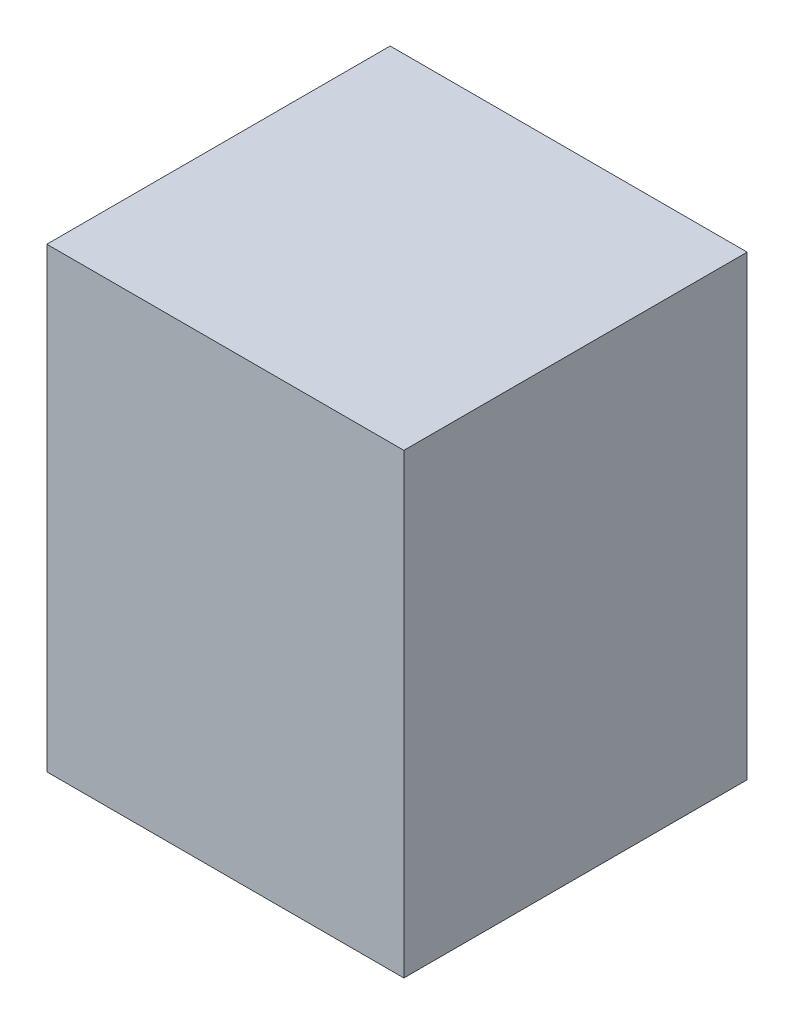
ISO-10303-21;
HEADER;
FILE_DESCRIPTION(('STEP AP214'),'2;1');
FILE_NAME('part.step','',(''),(''),'','','');
FILE_SCHEMA(('AUTOMOTIVE_DESIGN { 1 0 10303 214 1 1 1 1 }'));
ENDSEC;
DATA;
#1=APPLICATION_CONTEXT('core data for automotive mechanical design processes');
#2=APPLICATION_PROTOCOL_DEFINITION('international standard','automotive_design',2000,#1);
#3=PRODUCT_CONTEXT('',#1,'mechanical');
#4=PRODUCT('Part','Part','',(#3));
#5=PRODUCT_RELATED_PRODUCT_CATEGORY('part','',(#4));
#6=PRODUCT_DEFINITION_FORMATION('','',#4);
#7=PRODUCT_DEFINITION_CONTEXT('part definition',#1,'design');
#8=PRODUCT_DEFINITION('design','',#6,#7);
#9=PRODUCT_DEFINITION_SHAPE('','',#8);
#10=(LENGTH_UNIT() NAMED_UNIT(*) SI_UNIT(.MILLI.,.METRE.));
#11=(NAMED_UNIT(*) PLANE_ANGLE_UNIT() SI_UNIT($,.RADIAN.));
#12=(NAMED_UNIT(*) SI_UNIT($,.STERADIAN.) SOLID_ANGLE_UNIT());
#13=UNCERTAINTY_MEASURE_WITH_UNIT(LENGTH_MEASURE(1.E-05),#10,'distance_accuracy_value','');
#14=(GEOMETRIC_REPRESENTATION_CONTEXT(3) GLOBAL_UNCERTAINTY_ASSIGNED_CONTEXT((#13)) GLOBAL_UNIT_ASSIGNED_CONTEXT((#10,
#11,#12)) REPRESENTATION_CONTEXT('',''));
#15=CARTESIAN_POINT('',(0.,0.,0.));
#16=DIRECTION('',(0.,0.,1.));
#17=DIRECTION('',(1.,0.,0.));
#18=AXIS2_PLACEMENT_3D('',#15,#16,#17);
#19=CARTESIAN_POINT('',(-84.0290206079077,-281.7434461342,-434.633256851999));
#20=DIRECTION('',(1.,0.,0.));
#21=DIRECTION('',(0.,1.,0.));
#22=AXIS2_PLACEMENT_3D('',#19,#20,#21);
#23=PLANE('',#22);
#24=DIRECTION('',(0.,1.,0.));
#25=VECTOR('',#24,1.);
#26=CARTESIAN_POINT('',(-84.0290206079077,-281.7434461342,-434.633256851999));
#27=LINE('',#26,#25);
#28=CARTESIAN_POINT('',(-84.0290206079077,-281.7434461342,-434.633256851999));
#29=VERTEX_POINT('',#28);
#30=CARTESIAN_POINT('',(-84.0290206079077,-235.155967892815,-434.633256851999));
#31=VERTEX_POINT('',#30);
#32=EDGE_CURVE('E137',#29,#31,#27,.T.);
#33=ORIENTED_EDGE('',*,*,#32,.T.);
#34=DIRECTION('',(0.,0.,1.));
#35=VECTOR('',#34,1.);
#36=CARTESIAN_POINT('',(-84.0290206079077,-235.155967892815,-434.633256851999));
#37=LINE('',#36,#35);
#38=CARTESIAN_POINT('',(-84.0290206079077,-235.155967892815,-399.633256851999));
#39=VERTEX_POINT('',#38);
#40=EDGE_CURVE('E124',#31,#39,#37,.T.);
#41=ORIENTED_EDGE('',*,*,#40,.T.);
#42=DIRECTION('',(0.,1.,0.));
#43=VECTOR('',#42,1.);
#44=CARTESIAN_POINT('',(-84.0290206079077,-281.7434461342,-399.633256851999));
#45=LINE('',#44,#43);
#46=CARTESIAN_POINT('',(-84.0290206079077,-281.7434461342,-399.633256851999));
#47=VERTEX_POINT('',#46);
#48=EDGE_CURVE('E143',#47,#39,#45,.T.);
#49=ORIENTED_EDGE('',*,*,#48,.F.);
#50=DIRECTION('',(0.,0.,1.));
#51=VECTOR('',#50,1.);
#52=CARTESIAN_POINT('',(-84.0290206079077,-281.7434461342,-434.633256851999));
#53=LINE('',#52,#51);
#54=EDGE_CURVE('E123',#29,#47,#53,.T.);
#55=ORIENTED_EDGE('',*,*,#54,.F.);
#56=EDGE_LOOP('',(#33,#41,#49,#55));
#57=FACE_BOUND('',#56,.T.);
#58=ADVANCED_FACE('F37',(#57),#23,.T.);
#59=CARTESIAN_POINT('',(-84.0290206079077,-235.155967892815,-434.633256851999));
#60=DIRECTION('',(0.,1.,0.));
#61=DIRECTION('',(0.,0.,1.));
#62=AXIS2_PLACEMENT_3D('',#59,#60,#61);
#63=PLANE('',#62);
#64=DIRECTION('',(-1.,0.,0.));
#65=VECTOR('',#64,1.);
#66=CARTESIAN_POINT('',(-84.0290206079077,-235.155967892815,-399.633256851999));
#67=LINE('',#66,#65);
#68=CARTESIAN_POINT('',(-120.427773553477,-235.155967892815,-399.633256851999));
#69=VERTEX_POINT('',#68);
#70=EDGE_CURVE('E140',#39,#69,#67,.T.);
#71=ORIENTED_EDGE('',*,*,#70,.F.);
#72=ORIENTED_EDGE('',*,*,#40,.F.);
#73=DIRECTION('',(-1.,0.,0.));
#74=VECTOR('',#73,1.);
#75=CARTESIAN_POINT('',(-84.0290206079077,-235.155967892815,-434.633256851999));
#76=LINE('',#75,#74);
#77=CARTESIAN_POINT('',(-120.427773553477,-235.155967892815,-434.633256851999));
#78=VERTEX_POINT('',#77);
#79=EDGE_CURVE('E150',#31,#78,#76,.T.);
#80=ORIENTED_EDGE('',*,*,#79,.T.);
#81=DIRECTION('',(0.,0.,1.));
#82=VECTOR('',#81,1.);
#83=CARTESIAN_POINT('',(-120.427773553477,-235.155967892815,-434.633256851999));
#84=LINE('',#83,#82);
#85=EDGE_CURVE('E127',#78,#69,#84,.T.);
#86=ORIENTED_EDGE('',*,*,#85,.T.);
#87=EDGE_LOOP('',(#71,#72,#80,#86));
#88=FACE_BOUND('',#87,.T.);
#89=ADVANCED_FACE('F195',(#88),#63,.T.);
#90=CARTESIAN_POINT('',(-84.0290206079077,-281.7434461342,-434.633256851999));
#91=DIRECTION('',(0.,-1.,0.));
#92=DIRECTION('',(0.,0.,-1.));
#93=AXIS2_PLACEMENT_3D('',#90,#91,#92);
#94=PLANE('',#93);
#95=DIRECTION('',(1.,0.,0.));
#96=VECTOR('',#95,1.);
#97=CARTESIAN_POINT('',(-84.0290206079077,-281.7434461342,-399.633256851999));
#98=LINE('',#97,#96);
#99=CARTESIAN_POINT('',(-120.427773553477,-281.7434461342,-399.633256851999));
#100=VERTEX_POINT('',#99);
#101=EDGE_CURVE('E134',#100,#47,#98,.T.);
#102=ORIENTED_EDGE('',*,*,#101,.F.);
#103=DIRECTION('',(0.,0.,1.));
#104=VECTOR('',#103,1.);
#105=CARTESIAN_POINT('',(-120.427773553477,-281.7434461342,-434.633256851999));
#106=LINE('',#105,#104);
#107=CARTESIAN_POINT('',(-120.427773553477,-281.7434461342,-434.633256851999));
#108=VERTEX_POINT('',#107);
#109=EDGE_CURVE('E130',#108,#100,#106,.T.);
#110=ORIENTED_EDGE('',*,*,#109,.F.);
#111=DIRECTION('',(1.,0.,0.));
#112=VECTOR('',#111,1.);
#113=CARTESIAN_POINT('',(-84.0290206079077,-281.7434461342,-434.633256851999));
#114=LINE('',#113,#112);
#115=EDGE_CURVE('E128',#108,#29,#114,.T.);
#116=ORIENTED_EDGE('',*,*,#115,.T.);
#117=ORIENTED_EDGE('',*,*,#54,.T.);
#118=EDGE_LOOP('',(#102,#110,#116,#117));
#119=FACE_BOUND('',#118,.T.);
#120=ADVANCED_FACE('F188',(#119),#94,.T.);
#121=CARTESIAN_POINT('',(-118.208646157575,-270.427770621272,-417.633256852281));
#122=DIRECTION('',(-1.,0.,0.));
#123=DIRECTION('',(0.,1.,0.));
#124=AXIS2_PLACEMENT_3D('',#121,#122,#123);
#125=CYLINDRICAL_SURFACE('',#124,10.25);
#126=DIRECTION('',(-1.,0.,0.));
#127=VECTOR('',#126,1.);
#128=CARTESIAN_POINT('',(-118.408646157575,-260.205246471142,-416.883256852281));
#129=LINE('',#128,#127);
#130=CARTESIAN_POINT('',(-120.427773553477,-260.205246471142,-416.883256852281));
#131=VERTEX_POINT('',#130);
#132=CARTESIAN_POINT('',(-121.508646157575,-260.205246471142,-416.883256852281));
#133=VERTEX_POINT('',#132);
#134=EDGE_CURVE('E157',#131,#133,#129,.T.);
#135=ORIENTED_EDGE('',*,*,#134,.F.);
#136=CARTESIAN_POINT('',(-120.427773553477,-270.427770621272,-417.633256852281));
#137=DIRECTION('',(-1.,0.,0.));
#138=DIRECTION('',(0.,0.,1.));
#139=AXIS2_PLACEMENT_3D('',#136,#137,#138);
#140=CIRCLE('',#139,10.25);
#141=CARTESIAN_POINT('',(-120.427773553477,-260.205246471142,-418.383256852281));
#142=VERTEX_POINT('',#141);
#143=EDGE_CURVE('E119',#131,#142,#140,.T.);
#144=ORIENTED_EDGE('',*,*,#143,.T.);
#145=DIRECTION('',(-1.,0.,0.));
#146=VECTOR('',#145,1.);
#147=CARTESIAN_POINT('',(-118.408646157575,-260.205246471142,-418.383256852281));
#148=LINE('',#147,#146);
#149=CARTESIAN_POINT('',(-121.508646157575,-260.205246471142,-418.383256852281));
#150=VERTEX_POINT('',#149);
#151=EDGE_CURVE('E145',#142,#150,#148,.T.);
#152=ORIENTED_EDGE('',*,*,#151,.T.);
#153=CARTESIAN_POINT('',(-121.508646157575,-270.427770621272,-417.633256852281));
#154=DIRECTION('',(1.,0.,0.));
#155=DIRECTION('',(0.,0.997319429281019,-0.0731707317073083));
#156=AXIS2_PLACEMENT_3D('',#153,#154,#155);
#157=CIRCLE('',#156,10.25);
#158=EDGE_CURVE('E153',#150,#133,#157,.T.);
#159=ORIENTED_EDGE('',*,*,#158,.T.);
#160=EDGE_LOOP('',(#135,#144,#152,#159));
#161=FACE_BOUND('',#160,.T.);
#162=ADVANCED_FACE('F185',(#161),#125,.T.);
#163=CARTESIAN_POINT('',(-121.708646157575,-260.477770621272,-418.383256852281));
#164=DIRECTION('',(0.,0.,1.));
#165=DIRECTION('',(1.,0.,0.));
#166=AXIS2_PLACEMENT_3D('',#163,#164,#165);
#167=PLANE('',#166);
#168=DIRECTION('',(0.,1.,0.));
#169=VECTOR('',#168,1.);
#170=CARTESIAN_POINT('',(-120.427773553477,-281.7434461342,-418.383256852281));
#171=LINE('',#170,#169);
#172=CARTESIAN_POINT('',(-120.427773553477,-260.254275646582,-418.383256852281));
#173=VERTEX_POINT('',#172);
#174=EDGE_CURVE('E57',#173,#142,#171,.T.);
#175=ORIENTED_EDGE('',*,*,#174,.F.);
#176=DIRECTION('',(-1.,0.,0.));
#177=VECTOR('',#176,1.);
#178=CARTESIAN_POINT('',(-121.708646157575,-260.254275646582,-418.383256852281));
#179=LINE('',#178,#177);
#180=CARTESIAN_POINT('',(-121.557541287739,-260.254275646582,-418.383256852281));
#181=VERTEX_POINT('',#180);
#182=EDGE_CURVE('E11',#173,#181,#179,.T.);
#183=ORIENTED_EDGE('',*,*,#182,.T.);
#184=DIRECTION('',(0.706138185009302,0.708074052392664,0.));
#185=VECTOR('',#184,1.);
#186=CARTESIAN_POINT('',(-121.708646157575,-260.405794768182,-418.383256852281));
#187=LINE('',#186,#185);
#188=EDGE_CURVE('E114',#181,#150,#187,.T.);
#189=ORIENTED_EDGE('',*,*,#188,.T.);
#190=ORIENTED_EDGE('',*,*,#151,.F.);
#191=EDGE_LOOP('',(#175,#183,#189,#190));
#192=FACE_BOUND('',#191,.T.);
#193=ADVANCED_FACE('F183',(#192),#167,.F.);
#194=CARTESIAN_POINT('',(-121.708646157575,-259.477770621272,-416.883256852281));
#195=DIRECTION('',(0.,0.,-1.));
#196=DIRECTION('',(0.,-1.,0.));
#197=AXIS2_PLACEMENT_3D('',#194,#195,#196);
#198=PLANE('',#197);
#199=DIRECTION('',(-0.706138185009302,-0.708074052392664,0.));
#200=VECTOR('',#199,1.);
#201=CARTESIAN_POINT('',(-121.508646157575,-260.205246471142,-416.883256852281));
#202=LINE('',#201,#200);
#203=CARTESIAN_POINT('',(-121.557543265332,-260.254275646582,-416.883256706885));
#204=VERTEX_POINT('',#203);
#205=EDGE_CURVE('E113',#133,#204,#202,.T.);
#206=ORIENTED_EDGE('',*,*,#205,.T.);
#207=DIRECTION('',(1.,0.,0.));
#208=VECTOR('',#207,1.);
#209=CARTESIAN_POINT('',(-121.708646157575,-260.254275646582,-416.883256852281));
#210=LINE('',#209,#208);
#211=CARTESIAN_POINT('',(-120.427773553477,-260.254275646582,-416.883256852281));
#212=VERTEX_POINT('',#211);
#213=EDGE_CURVE('E104',#204,#212,#210,.T.);
#214=ORIENTED_EDGE('',*,*,#213,.T.);
#215=DIRECTION('',(0.,-1.,0.));
#216=VECTOR('',#215,1.);
#217=CARTESIAN_POINT('',(-120.427773553477,-281.7434461342,-416.883256852281));
#218=LINE('',#217,#216);
#219=EDGE_CURVE('E45',#131,#212,#218,.T.);
#220=ORIENTED_EDGE('',*,*,#219,.F.);
#221=ORIENTED_EDGE('',*,*,#134,.T.);
#222=EDGE_LOOP('',(#206,#214,#220,#221));
#223=FACE_BOUND('',#222,.T.);
#224=ADVANCED_FACE('F110',(#223),#198,.F.);
#225=CARTESIAN_POINT('',(-121.608646157575,-270.427770621272,-417.633256852281));
#226=DIRECTION('',(1.,0.,0.));
#227=DIRECTION('',(0.,0.,1.));
#228=AXIS2_PLACEMENT_3D('',#225,#226,#227);
#229=CONICAL_SURFACE('',#228,10.15,0.785398163397448);
#230=CARTESIAN_POINT('',(-121.336395093508,-260.254275646582,-415.369782257239));
#231=CARTESIAN_POINT('',(-121.36398152483,-260.254275646582,-415.496794776909));
#232=CARTESIAN_POINT('',(-121.389448768857,-260.254275646582,-415.624260764332));
#233=CARTESIAN_POINT('',(-121.435950163698,-260.254275646582,-415.880012682511));
#234=CARTESIAN_POINT('',(-121.456983812732,-260.254275646582,-416.008298704385));
#235=CARTESIAN_POINT('',(-121.513145376527,-260.254275646582,-416.394294332638));
#236=CARTESIAN_POINT('',(-121.541316219123,-260.254275646582,-416.653061085765));
#237=CARTESIAN_POINT('',(-121.57769872073,-260.254275646582,-417.167860753992));
#238=CARTESIAN_POINT('',(-121.586219234648,-260.254275646582,-417.423872113027));
#239=CARTESIAN_POINT('',(-121.583870248953,-260.254275646582,-417.935717507208));
#240=CARTESIAN_POINT('',(-121.573009805891,-260.254275646582,-418.191551569322));
#241=CARTESIAN_POINT('',(-121.543017983031,-260.254275646582,-418.568013140817));
#242=CARTESIAN_POINT('',(-121.531198865731,-260.254275646582,-418.689268177817));
#243=CARTESIAN_POINT('',(-121.503380832884,-260.254275646582,-418.931288036405));
#244=CARTESIAN_POINT('',(-121.487382307032,-260.254275646582,-419.052052902633));
#245=CARTESIAN_POINT('',(-121.433053550914,-260.254275646582,-419.415281377417));
#246=CARTESIAN_POINT('',(-121.388539975891,-260.254275646582,-419.656838967734));
#247=CARTESIAN_POINT('',(-121.336395093508,-260.254275646582,-419.896731447323));
#248=B_SPLINE_CURVE_WITH_KNOTS('',3,(#230,#231,#232,#233,#234,#235,#236,#237,#238,#239,#240,
#241,#242,#243,#244,#245,#246,#247),.UNSPECIFIED.,.F.,.F.,(4,2,2,2,2,2,2,2,4),(0.,
0.389886604186929,0.7798173107705,1.55992518102586,2.32768556667114,3.09508727854521,
3.46051597745943,3.8259106152731,4.56222596331037),.UNSPECIFIED.);
#249=EDGE_CURVE('E106',#204,#181,#248,.T.);
#250=ORIENTED_EDGE('',*,*,#249,.F.);
#251=ORIENTED_EDGE('',*,*,#205,.F.);
#252=ORIENTED_EDGE('',*,*,#158,.F.);
#253=ORIENTED_EDGE('',*,*,#188,.F.);
#254=EDGE_LOOP('',(#250,#251,#252,#253));
#255=FACE_BOUND('',#254,.T.);
#256=ADVANCED_FACE('F173',(#255),#229,.T.);
#257=CARTESIAN_POINT('',(-89.1086461575213,-258.427770621172,-399.633256851999));
#258=DIRECTION('',(0.,0.,1.));
#259=DIRECTION('',(0.,-1.,0.));
#260=AXIS2_PLACEMENT_3D('',#257,#258,#259);
#261=PLANE('',#260);
#262=ORIENTED_EDGE('',*,*,#48,.T.);
#263=ORIENTED_EDGE('',*,*,#70,.T.);
#264=DIRECTION('',(0.,-1.,0.));
#265=VECTOR('',#264,1.);
#266=CARTESIAN_POINT('',(-120.427773553477,-281.7434461342,-399.633256851999));
#267=LINE('',#266,#265);
#268=EDGE_CURVE('E138',#69,#100,#267,.T.);
#269=ORIENTED_EDGE('',*,*,#268,.T.);
#270=ORIENTED_EDGE('',*,*,#101,.T.);
#271=EDGE_LOOP('',(#262,#263,#269,#270));
#272=FACE_BOUND('',#271,.T.);
#273=ADVANCED_FACE('F39',(#272),#261,.T.);
#274=CARTESIAN_POINT('',(0.,0.,-434.633256851999));
#275=DIRECTION('',(0.,0.,1.));
#276=DIRECTION('',(1.,0.,0.));
#277=AXIS2_PLACEMENT_3D('',#274,#275,#276);
#278=PLANE('',#277);
#279=DIRECTION('',(0.,-1.,0.));
#280=VECTOR('',#279,1.);
#281=CARTESIAN_POINT('',(-120.427773553477,-281.7434461342,-434.633256851999));
#282=LINE('',#281,#280);
#283=EDGE_CURVE('E148',#78,#108,#282,.T.);
#284=ORIENTED_EDGE('',*,*,#283,.F.);
#285=ORIENTED_EDGE('',*,*,#79,.F.);
#286=ORIENTED_EDGE('',*,*,#32,.F.);
#287=ORIENTED_EDGE('',*,*,#115,.F.);
#288=EDGE_LOOP('',(#284,#285,#286,#287));
#289=FACE_BOUND('',#288,.T.);
#290=ADVANCED_FACE('F180',(#289),#278,.F.);
#291=CARTESIAN_POINT('',(-120.427773553477,-260.254275646582,-439.153256851999));
#292=DIRECTION('',(0.,1.,0.));
#293=DIRECTION('',(0.,0.,1.));
#294=AXIS2_PLACEMENT_3D('',#291,#292,#293);
#295=PLANE('',#294);
#296=ORIENTED_EDGE('',*,*,#249,.T.);
#297=ORIENTED_EDGE('',*,*,#182,.F.);
#298=DIRECTION('',(0.,0.,1.));
#299=VECTOR('',#298,1.);
#300=CARTESIAN_POINT('',(-120.427773553477,-260.254275646582,-439.153256851999));
#301=LINE('',#300,#299);
#302=EDGE_CURVE('E52',#173,#212,#301,.T.);
#303=ORIENTED_EDGE('',*,*,#302,.T.);
#304=ORIENTED_EDGE('',*,*,#213,.F.);
#305=EDGE_LOOP('',(#296,#297,#303,#304));
#306=FACE_BOUND('',#305,.T.);
#307=ADVANCED_FACE('F103',(#306),#295,.F.);
#308=CARTESIAN_POINT('',(-120.427773553477,-281.7434461342,-434.633256851999));
#309=DIRECTION('',(-1.,0.,0.));
#310=DIRECTION('',(0.,0.,1.));
#311=AXIS2_PLACEMENT_3D('',#308,#309,#310);
#312=PLANE('',#311);
#313=ORIENTED_EDGE('',*,*,#219,.T.);
#314=ORIENTED_EDGE('',*,*,#302,.F.);
#315=ORIENTED_EDGE('',*,*,#174,.T.);
#316=ORIENTED_EDGE('',*,*,#143,.F.);
#317=EDGE_LOOP('',(#313,#314,#315,#316));
#318=FACE_BOUND('',#317,.T.);
#319=ORIENTED_EDGE('',*,*,#109,.T.);
#320=ORIENTED_EDGE('',*,*,#268,.F.);
#321=ORIENTED_EDGE('',*,*,#85,.F.);
#322=ORIENTED_EDGE('',*,*,#283,.T.);
#323=EDGE_LOOP('',(#319,#320,#321,#322));
#324=FACE_BOUND('',#323,.T.);
#325=ADVANCED_FACE('F116',(#318,#324),#312,.T.);
#326=CLOSED_SHELL('',(#58,#89,#120,#162,#193,#224,#256,#273,#290,#307,#325));
#327=MANIFOLD_SOLID_BREP('B2',#326);
#328=ADVANCED_BREP_SHAPE_REPRESENTATION('',(#18,#327),#14);
#329=SHAPE_DEFINITION_REPRESENTATION(#9,#328);
ENDSEC;
END-ISO-10303-21;
